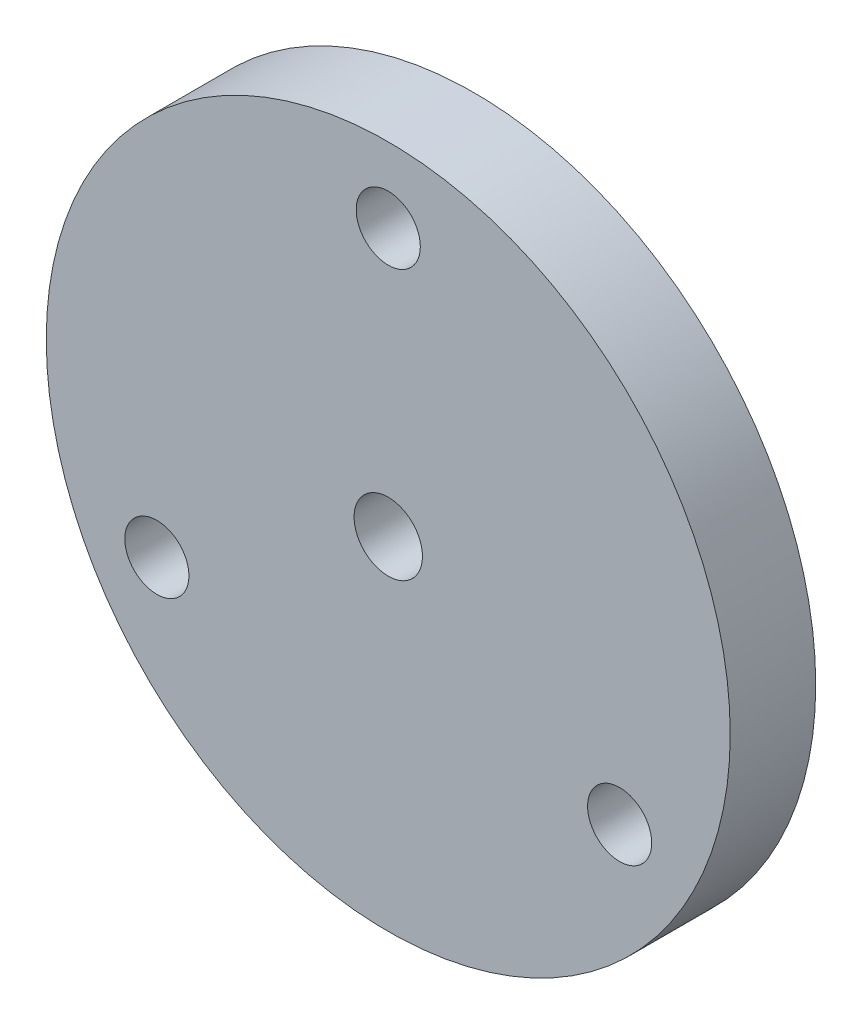
ISO-10303-21;
HEADER;
FILE_DESCRIPTION(('STEP AP214'),'2;1');
FILE_NAME('part.step','',(''),(''),'','','');
FILE_SCHEMA(('AUTOMOTIVE_DESIGN { 1 0 10303 214 1 1 1 1 }'));
ENDSEC;
DATA;
#1=APPLICATION_CONTEXT('core data for automotive mechanical design processes');
#2=APPLICATION_PROTOCOL_DEFINITION('international standard','automotive_design',2000,#1);
#3=PRODUCT_CONTEXT('',#1,'mechanical');
#4=PRODUCT('Part','Part','',(#3));
#5=PRODUCT_RELATED_PRODUCT_CATEGORY('part','',(#4));
#6=PRODUCT_DEFINITION_FORMATION('','',#4);
#7=PRODUCT_DEFINITION_CONTEXT('part definition',#1,'design');
#8=PRODUCT_DEFINITION('design','',#6,#7);
#9=PRODUCT_DEFINITION_SHAPE('','',#8);
#10=(LENGTH_UNIT() NAMED_UNIT(*) SI_UNIT(.MILLI.,.METRE.));
#11=(NAMED_UNIT(*) PLANE_ANGLE_UNIT() SI_UNIT($,.RADIAN.));
#12=(NAMED_UNIT(*) SI_UNIT($,.STERADIAN.) SOLID_ANGLE_UNIT());
#13=UNCERTAINTY_MEASURE_WITH_UNIT(LENGTH_MEASURE(1.E-05),#10,'distance_accuracy_value','');
#14=(GEOMETRIC_REPRESENTATION_CONTEXT(3) GLOBAL_UNCERTAINTY_ASSIGNED_CONTEXT((#13)) GLOBAL_UNIT_ASSIGNED_CONTEXT((#10,
#11,#12)) REPRESENTATION_CONTEXT('',''));
#15=CARTESIAN_POINT('',(0.,0.,0.));
#16=DIRECTION('',(0.,0.,1.));
#17=DIRECTION('',(1.,0.,0.));
#18=AXIS2_PLACEMENT_3D('',#15,#16,#17);
#19=CARTESIAN_POINT('',(0.,0.,4.));
#20=DIRECTION('',(0.,0.,1.));
#21=DIRECTION('',(1.,0.,0.));
#22=AXIS2_PLACEMENT_3D('',#19,#20,#21);
#23=PLANE('',#22);
#24=CARTESIAN_POINT('',(10.8253175473055,-6.24999999999999,4.));
#25=DIRECTION('',(0.,0.,1.));
#26=DIRECTION('',(1.,0.,0.));
#27=AXIS2_PLACEMENT_3D('',#24,#25,#26);
#28=CIRCLE('',#27,1.50000000000006);
#29=CARTESIAN_POINT('',(12.3253175473056,-6.24999999999999,4.));
#30=VERTEX_POINT('',#29);
#31=EDGE_CURVE('E64',#30,#30,#28,.T.);
#32=ORIENTED_EDGE('',*,*,#31,.F.);
#33=EDGE_LOOP('',(#32));
#34=FACE_BOUND('',#33,.T.);
#35=CARTESIAN_POINT('',(0.,12.5,4.));
#36=DIRECTION('',(0.,0.,1.));
#37=DIRECTION('',(1.,0.,0.));
#38=AXIS2_PLACEMENT_3D('',#35,#36,#37);
#39=CIRCLE('',#38,1.5);
#40=CARTESIAN_POINT('',(1.5,12.5,4.));
#41=VERTEX_POINT('',#40);
#42=EDGE_CURVE('E50',#41,#41,#39,.T.);
#43=ORIENTED_EDGE('',*,*,#42,.F.);
#44=EDGE_LOOP('',(#43));
#45=FACE_BOUND('',#44,.T.);
#46=CARTESIAN_POINT('',(0.,0.,4.));
#47=DIRECTION('',(0.,0.,1.));
#48=DIRECTION('',(1.,0.,0.));
#49=AXIS2_PLACEMENT_3D('',#46,#47,#48);
#50=CIRCLE('',#49,16.);
#51=CARTESIAN_POINT('',(16.,0.,4.));
#52=VERTEX_POINT('',#51);
#53=EDGE_CURVE('E10',#52,#52,#50,.T.);
#54=ORIENTED_EDGE('',*,*,#53,.T.);
#55=EDGE_LOOP('',(#54));
#56=FACE_BOUND('',#55,.T.);
#57=CARTESIAN_POINT('',(0.,0.,4.));
#58=DIRECTION('',(0.,0.,1.));
#59=DIRECTION('',(1.,0.,0.));
#60=AXIS2_PLACEMENT_3D('',#57,#58,#59);
#61=CIRCLE('',#60,1.6);
#62=CARTESIAN_POINT('',(1.6,0.,4.));
#63=VERTEX_POINT('',#62);
#64=EDGE_CURVE('E56',#63,#63,#61,.T.);
#65=ORIENTED_EDGE('',*,*,#64,.F.);
#66=EDGE_LOOP('',(#65));
#67=FACE_BOUND('',#66,.T.);
#68=CARTESIAN_POINT('',(-10.8253175473055,-6.25000000000001,4.));
#69=DIRECTION('',(0.,0.,1.));
#70=DIRECTION('',(1.,0.,0.));
#71=AXIS2_PLACEMENT_3D('',#68,#69,#70);
#72=CIRCLE('',#71,1.50000000000012);
#73=CARTESIAN_POINT('',(-9.32531754730535,-6.25000000000001,4.));
#74=VERTEX_POINT('',#73);
#75=EDGE_CURVE('E72',#74,#74,#72,.T.);
#76=ORIENTED_EDGE('',*,*,#75,.F.);
#77=EDGE_LOOP('',(#76));
#78=FACE_BOUND('',#77,.T.);
#79=ADVANCED_FACE('F37',(#34,#45,#56,#67,#78),#23,.T.);
#80=CARTESIAN_POINT('',(0.,0.,0.));
#81=DIRECTION('',(0.,0.,1.));
#82=DIRECTION('',(1.,0.,0.));
#83=AXIS2_PLACEMENT_3D('',#80,#81,#82);
#84=PLANE('',#83);
#85=CARTESIAN_POINT('',(0.,0.,0.));
#86=DIRECTION('',(0.,0.,1.));
#87=DIRECTION('',(1.,0.,0.));
#88=AXIS2_PLACEMENT_3D('',#85,#86,#87);
#89=CIRCLE('',#88,16.);
#90=CARTESIAN_POINT('',(16.,0.,0.));
#91=VERTEX_POINT('',#90);
#92=EDGE_CURVE('E41',#91,#91,#89,.T.);
#93=ORIENTED_EDGE('',*,*,#92,.F.);
#94=EDGE_LOOP('',(#93));
#95=FACE_BOUND('',#94,.T.);
#96=CARTESIAN_POINT('',(0.,12.5,0.));
#97=DIRECTION('',(0.,0.,1.));
#98=DIRECTION('',(1.,0.,0.));
#99=AXIS2_PLACEMENT_3D('',#96,#97,#98);
#100=CIRCLE('',#99,1.5);
#101=CARTESIAN_POINT('',(1.5,12.5,0.));
#102=VERTEX_POINT('',#101);
#103=EDGE_CURVE('E52',#102,#102,#100,.T.);
#104=ORIENTED_EDGE('',*,*,#103,.T.);
#105=EDGE_LOOP('',(#104));
#106=FACE_BOUND('',#105,.T.);
#107=CARTESIAN_POINT('',(0.,0.,0.));
#108=DIRECTION('',(0.,0.,1.));
#109=DIRECTION('',(1.,0.,0.));
#110=AXIS2_PLACEMENT_3D('',#107,#108,#109);
#111=CIRCLE('',#110,1.6);
#112=CARTESIAN_POINT('',(1.6,0.,0.));
#113=VERTEX_POINT('',#112);
#114=EDGE_CURVE('E60',#113,#113,#111,.T.);
#115=ORIENTED_EDGE('',*,*,#114,.T.);
#116=EDGE_LOOP('',(#115));
#117=FACE_BOUND('',#116,.T.);
#118=CARTESIAN_POINT('',(10.8253175473055,-6.24999999999999,0.));
#119=DIRECTION('',(0.,0.,1.));
#120=DIRECTION('',(1.,0.,0.));
#121=AXIS2_PLACEMENT_3D('',#118,#119,#120);
#122=CIRCLE('',#121,1.50000000000006);
#123=CARTESIAN_POINT('',(12.3253175473056,-6.24999999999999,0.));
#124=VERTEX_POINT('',#123);
#125=EDGE_CURVE('E68',#124,#124,#122,.T.);
#126=ORIENTED_EDGE('',*,*,#125,.T.);
#127=EDGE_LOOP('',(#126));
#128=FACE_BOUND('',#127,.T.);
#129=CARTESIAN_POINT('',(-10.8253175473055,-6.25000000000001,0.));
#130=DIRECTION('',(0.,0.,1.));
#131=DIRECTION('',(1.,0.,0.));
#132=AXIS2_PLACEMENT_3D('',#129,#130,#131);
#133=CIRCLE('',#132,1.50000000000012);
#134=CARTESIAN_POINT('',(-9.32531754730535,-6.25000000000001,0.));
#135=VERTEX_POINT('',#134);
#136=EDGE_CURVE('E76',#135,#135,#133,.T.);
#137=ORIENTED_EDGE('',*,*,#136,.T.);
#138=EDGE_LOOP('',(#137));
#139=FACE_BOUND('',#138,.T.);
#140=ADVANCED_FACE('F88',(#95,#106,#117,#128,#139),#84,.F.);
#141=CARTESIAN_POINT('',(0.,0.,4.));
#142=DIRECTION('',(0.,0.,-1.));
#143=DIRECTION('',(-1.,0.,0.));
#144=AXIS2_PLACEMENT_3D('',#141,#142,#143);
#145=CYLINDRICAL_SURFACE('',#144,16.);
#146=ORIENTED_EDGE('',*,*,#53,.F.);
#147=EDGE_LOOP('',(#146));
#148=FACE_BOUND('',#147,.T.);
#149=ORIENTED_EDGE('',*,*,#92,.T.);
#150=EDGE_LOOP('',(#149));
#151=FACE_BOUND('',#150,.T.);
#152=ADVANCED_FACE('F39',(#148,#151),#145,.T.);
#153=CARTESIAN_POINT('',(0.,12.5,4.));
#154=DIRECTION('',(0.,0.,-1.));
#155=DIRECTION('',(-1.,0.,0.));
#156=AXIS2_PLACEMENT_3D('',#153,#154,#155);
#157=CYLINDRICAL_SURFACE('',#156,1.5);
#158=ORIENTED_EDGE('',*,*,#42,.T.);
#159=EDGE_LOOP('',(#158));
#160=FACE_BOUND('',#159,.T.);
#161=ORIENTED_EDGE('',*,*,#103,.F.);
#162=EDGE_LOOP('',(#161));
#163=FACE_BOUND('',#162,.T.);
#164=ADVANCED_FACE('F98',(#160,#163),#157,.F.);
#165=CARTESIAN_POINT('',(0.,0.,4.));
#166=DIRECTION('',(0.,0.,-1.));
#167=DIRECTION('',(-1.,0.,0.));
#168=AXIS2_PLACEMENT_3D('',#165,#166,#167);
#169=CYLINDRICAL_SURFACE('',#168,1.6);
#170=ORIENTED_EDGE('',*,*,#64,.T.);
#171=EDGE_LOOP('',(#170));
#172=FACE_BOUND('',#171,.T.);
#173=ORIENTED_EDGE('',*,*,#114,.F.);
#174=EDGE_LOOP('',(#173));
#175=FACE_BOUND('',#174,.T.);
#176=ADVANCED_FACE('F101',(#172,#175),#169,.F.);
#177=CARTESIAN_POINT('',(10.8253175473055,-6.24999999999999,4.));
#178=DIRECTION('',(0.,0.,-1.));
#179=DIRECTION('',(-1.,0.,0.));
#180=AXIS2_PLACEMENT_3D('',#177,#178,#179);
#181=CYLINDRICAL_SURFACE('',#180,1.50000000000006);
#182=ORIENTED_EDGE('',*,*,#31,.T.);
#183=EDGE_LOOP('',(#182));
#184=FACE_BOUND('',#183,.T.);
#185=ORIENTED_EDGE('',*,*,#125,.F.);
#186=EDGE_LOOP('',(#185));
#187=FACE_BOUND('',#186,.T.);
#188=ADVANCED_FACE('F105',(#184,#187),#181,.F.);
#189=CARTESIAN_POINT('',(-10.8253175473055,-6.25000000000001,4.));
#190=DIRECTION('',(0.,0.,-1.));
#191=DIRECTION('',(-1.,0.,0.));
#192=AXIS2_PLACEMENT_3D('',#189,#190,#191);
#193=CYLINDRICAL_SURFACE('',#192,1.50000000000012);
#194=ORIENTED_EDGE('',*,*,#75,.T.);
#195=EDGE_LOOP('',(#194));
#196=FACE_BOUND('',#195,.T.);
#197=ORIENTED_EDGE('',*,*,#136,.F.);
#198=EDGE_LOOP('',(#197));
#199=FACE_BOUND('',#198,.T.);
#200=ADVANCED_FACE('F84',(#196,#199),#193,.F.);
#201=CLOSED_SHELL('',(#79,#140,#152,#164,#176,#188,#200));
#202=MANIFOLD_SOLID_BREP('B2',#201);
#203=ADVANCED_BREP_SHAPE_REPRESENTATION('',(#18,#202),#14);
#204=SHAPE_DEFINITION_REPRESENTATION(#9,#203);
ENDSEC;
END-ISO-10303-21;
